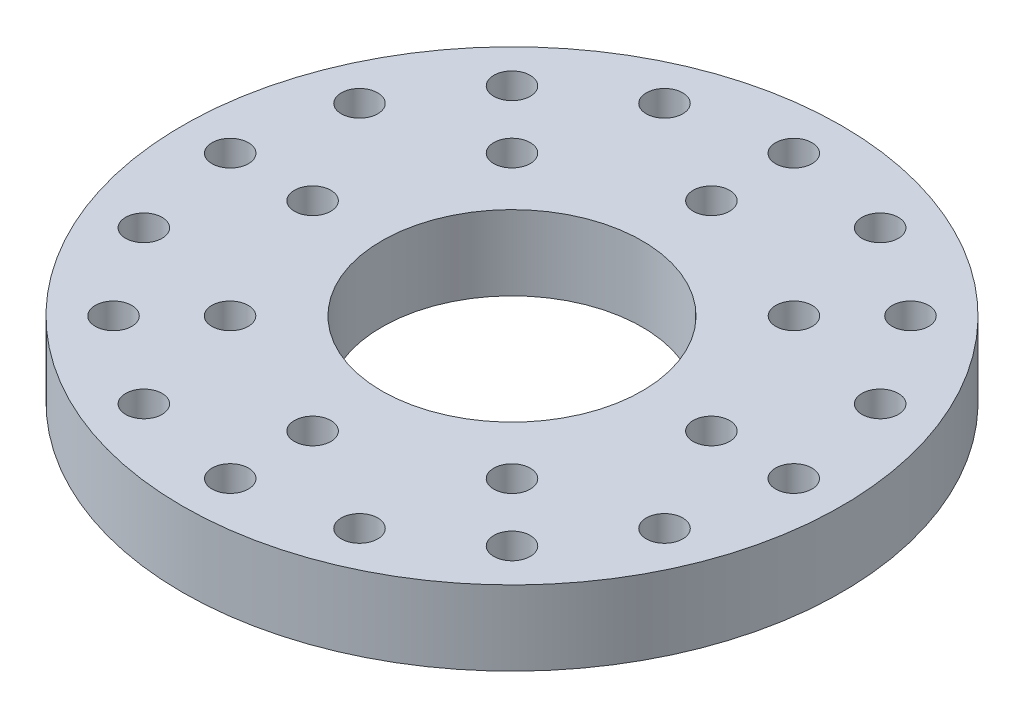
ISO-10303-21;
HEADER;
FILE_DESCRIPTION(('STEP AP214'),'2;1');
FILE_NAME('part.step','',(''),(''),'','','');
FILE_SCHEMA(('AUTOMOTIVE_DESIGN { 1 0 10303 214 1 1 1 1 }'));
ENDSEC;
DATA;
#1=APPLICATION_CONTEXT('core data for automotive mechanical design processes');
#2=APPLICATION_PROTOCOL_DEFINITION('international standard','automotive_design',2000,#1);
#3=PRODUCT_CONTEXT('',#1,'mechanical');
#4=PRODUCT('Part','Part','',(#3));
#5=PRODUCT_RELATED_PRODUCT_CATEGORY('part','',(#4));
#6=PRODUCT_DEFINITION_FORMATION('','',#4);
#7=PRODUCT_DEFINITION_CONTEXT('part definition',#1,'design');
#8=PRODUCT_DEFINITION('design','',#6,#7);
#9=PRODUCT_DEFINITION_SHAPE('','',#8);
#10=(LENGTH_UNIT() NAMED_UNIT(*) SI_UNIT(.MILLI.,.METRE.));
#11=(NAMED_UNIT(*) PLANE_ANGLE_UNIT() SI_UNIT($,.RADIAN.));
#12=(NAMED_UNIT(*) SI_UNIT($,.STERADIAN.) SOLID_ANGLE_UNIT());
#13=UNCERTAINTY_MEASURE_WITH_UNIT(LENGTH_MEASURE(1.E-05),#10,'distance_accuracy_value','');
#14=(GEOMETRIC_REPRESENTATION_CONTEXT(3) GLOBAL_UNCERTAINTY_ASSIGNED_CONTEXT((#13)) GLOBAL_UNIT_ASSIGNED_CONTEXT((#10,
#11,#12)) REPRESENTATION_CONTEXT('',''));
#15=CARTESIAN_POINT('',(0.,0.,0.));
#16=DIRECTION('',(0.,0.,1.));
#17=DIRECTION('',(1.,0.,0.));
#18=AXIS2_PLACEMENT_3D('',#15,#16,#17);
#19=CARTESIAN_POINT('',(0.,17.272,0.));
#20=DIRECTION('',(0.,1.,0.));
#21=DIRECTION('',(0.,0.,1.));
#22=AXIS2_PLACEMENT_3D('',#19,#20,#21);
#23=PLANE('',#22);
#24=CARTESIAN_POINT('',(46.0687139010842,17.272,-46.0687139010853));
#25=DIRECTION('',(0.,1.,0.));
#26=DIRECTION('',(0.,0.,1.));
#27=AXIS2_PLACEMENT_3D('',#24,#25,#26);
#28=CIRCLE('',#27,4.2164);
#29=CARTESIAN_POINT('',(46.0687139010842,17.272,-41.8523139010853));
#30=VERTEX_POINT('',#29);
#31=EDGE_CURVE('E178',#30,#30,#28,.F.);
#32=ORIENTED_EDGE('',*,*,#31,.T.);
#33=EDGE_LOOP('',(#32));
#34=FACE_BOUND('',#33,.T.);
#35=CARTESIAN_POINT('',(65.151,17.272,-6.82420502120907E-13));
#36=DIRECTION('',(0.,1.,0.));
#37=DIRECTION('',(0.,0.,1.));
#38=AXIS2_PLACEMENT_3D('',#35,#36,#37);
#39=CIRCLE('',#38,4.2164);
#40=CARTESIAN_POINT('',(65.151,17.272,4.21639999999932));
#41=VERTEX_POINT('',#40);
#42=EDGE_CURVE('E166',#41,#41,#39,.F.);
#43=ORIENTED_EDGE('',*,*,#42,.T.);
#44=EDGE_LOOP('',(#43));
#45=FACE_BOUND('',#44,.T.);
#46=CARTESIAN_POINT('',(46.0687139010852,17.272,46.0687139010844));
#47=DIRECTION('',(0.,1.,0.));
#48=DIRECTION('',(0.,0.,1.));
#49=AXIS2_PLACEMENT_3D('',#46,#47,#48);
#50=CIRCLE('',#49,4.2164);
#51=CARTESIAN_POINT('',(46.0687139010852,17.272,50.2851139010844));
#52=VERTEX_POINT('',#51);
#53=EDGE_CURVE('E154',#52,#52,#50,.F.);
#54=ORIENTED_EDGE('',*,*,#53,.T.);
#55=EDGE_LOOP('',(#54));
#56=FACE_BOUND('',#55,.T.);
#57=CARTESIAN_POINT('',(4.54947001413938E-13,17.272,65.151));
#58=DIRECTION('',(0.,1.,0.));
#59=DIRECTION('',(0.,0.,1.));
#60=AXIS2_PLACEMENT_3D('',#57,#58,#59);
#61=CIRCLE('',#60,4.2164);
#62=CARTESIAN_POINT('',(4.54947001413938E-13,17.272,69.3674));
#63=VERTEX_POINT('',#62);
#64=EDGE_CURVE('E142',#63,#63,#61,.F.);
#65=ORIENTED_EDGE('',*,*,#64,.T.);
#66=EDGE_LOOP('',(#65));
#67=FACE_BOUND('',#66,.T.);
#68=CARTESIAN_POINT('',(-46.0687139010845,17.272,46.068713901085));
#69=DIRECTION('',(0.,1.,0.));
#70=DIRECTION('',(0.,0.,1.));
#71=AXIS2_PLACEMENT_3D('',#68,#69,#70);
#72=CIRCLE('',#71,4.2164);
#73=CARTESIAN_POINT('',(-46.0687139010845,17.272,50.285113901085));
#74=VERTEX_POINT('',#73);
#75=EDGE_CURVE('E130',#74,#74,#72,.F.);
#76=ORIENTED_EDGE('',*,*,#75,.T.);
#77=EDGE_LOOP('',(#76));
#78=FACE_BOUND('',#77,.T.);
#79=CARTESIAN_POINT('',(-65.151,17.272,2.27473500706969E-13));
#80=DIRECTION('',(0.,1.,0.));
#81=DIRECTION('',(0.,0.,1.));
#82=AXIS2_PLACEMENT_3D('',#79,#80,#81);
#83=CIRCLE('',#82,4.2164);
#84=CARTESIAN_POINT('',(-65.151,17.272,4.21640000000023));
#85=VERTEX_POINT('',#84);
#86=EDGE_CURVE('E118',#85,#85,#83,.F.);
#87=ORIENTED_EDGE('',*,*,#86,.T.);
#88=EDGE_LOOP('',(#87));
#89=FACE_BOUND('',#88,.T.);
#90=CARTESIAN_POINT('',(-46.0687139010848,17.272,-46.0687139010847));
#91=DIRECTION('',(0.,1.,0.));
#92=DIRECTION('',(0.,0.,1.));
#93=AXIS2_PLACEMENT_3D('',#90,#91,#92);
#94=CIRCLE('',#93,4.2164);
#95=CARTESIAN_POINT('',(-46.0687139010848,17.272,-41.8523139010847));
#96=VERTEX_POINT('',#95);
#97=EDGE_CURVE('E106',#96,#96,#94,.F.);
#98=ORIENTED_EDGE('',*,*,#97,.T.);
#99=EDGE_LOOP('',(#98));
#100=FACE_BOUND('',#99,.T.);
#101=CARTESIAN_POINT('',(0.,17.272,-65.151));
#102=DIRECTION('',(0.,1.,0.));
#103=DIRECTION('',(0.,0.,1.));
#104=AXIS2_PLACEMENT_3D('',#101,#102,#103);
#105=CIRCLE('',#104,4.2164);
#106=CARTESIAN_POINT('',(0.,17.272,-60.9346));
#107=VERTEX_POINT('',#106);
#108=EDGE_CURVE('E94',#107,#107,#105,.F.);
#109=ORIENTED_EDGE('',*,*,#108,.T.);
#110=EDGE_LOOP('',(#109));
#111=FACE_BOUND('',#110,.T.);
#112=CARTESIAN_POINT('',(46.101,17.272,-4.82882343606022E-13));
#113=DIRECTION('',(0.,1.,0.));
#114=DIRECTION('',(0.,0.,1.));
#115=AXIS2_PLACEMENT_3D('',#112,#113,#114);
#116=CIRCLE('',#115,4.2164);
#117=CARTESIAN_POINT('',(46.101,17.272,4.21639999999952));
#118=VERTEX_POINT('',#117);
#119=EDGE_CURVE('E82',#118,#118,#116,.F.);
#120=ORIENTED_EDGE('',*,*,#119,.T.);
#121=EDGE_LOOP('',(#120));
#122=FACE_BOUND('',#121,.T.);
#123=CARTESIAN_POINT('',(3.21921562404015E-13,17.272,46.101));
#124=DIRECTION('',(0.,1.,0.));
#125=DIRECTION('',(0.,0.,1.));
#126=AXIS2_PLACEMENT_3D('',#123,#124,#125);
#127=CIRCLE('',#126,4.2164);
#128=CARTESIAN_POINT('',(3.21921562404015E-13,17.272,50.3174));
#129=VERTEX_POINT('',#128);
#130=EDGE_CURVE('E70',#129,#129,#127,.F.);
#131=ORIENTED_EDGE('',*,*,#130,.T.);
#132=EDGE_LOOP('',(#131));
#133=FACE_BOUND('',#132,.T.);
#134=CARTESIAN_POINT('',(-46.101,17.272,1.60960781202007E-13));
#135=DIRECTION('',(0.,1.,0.));
#136=DIRECTION('',(0.,0.,1.));
#137=AXIS2_PLACEMENT_3D('',#134,#135,#136);
#138=CIRCLE('',#137,4.2164);
#139=CARTESIAN_POINT('',(-46.101,17.272,4.21640000000016));
#140=VERTEX_POINT('',#139);
#141=EDGE_CURVE('E58',#140,#140,#138,.F.);
#142=ORIENTED_EDGE('',*,*,#141,.T.);
#143=EDGE_LOOP('',(#142));
#144=FACE_BOUND('',#143,.T.);
#145=CARTESIAN_POINT('',(0.,17.272,-46.101));
#146=DIRECTION('',(0.,1.,0.));
#147=DIRECTION('',(0.,0.,1.));
#148=AXIS2_PLACEMENT_3D('',#145,#146,#147);
#149=CIRCLE('',#148,4.2164);
#150=CARTESIAN_POINT('',(0.,17.272,-41.8846));
#151=VERTEX_POINT('',#150);
#152=EDGE_CURVE('E46',#151,#151,#149,.F.);
#153=ORIENTED_EDGE('',*,*,#152,.T.);
#154=EDGE_LOOP('',(#153));
#155=FACE_BOUND('',#154,.T.);
#156=CARTESIAN_POINT('',(0.,17.272,0.));
#157=DIRECTION('',(0.,1.,0.));
#158=DIRECTION('',(0.,0.,1.));
#159=AXIS2_PLACEMENT_3D('',#156,#157,#158);
#160=CIRCLE('',#159,76.2);
#161=CARTESIAN_POINT('',(0.,17.272,76.2));
#162=VERTEX_POINT('',#161);
#163=EDGE_CURVE('E10',#162,#162,#160,.T.);
#164=ORIENTED_EDGE('',*,*,#163,.T.);
#165=EDGE_LOOP('',(#164));
#166=FACE_BOUND('',#165,.T.);
#167=CARTESIAN_POINT('',(0.,17.272,0.));
#168=DIRECTION('',(0.,1.,0.));
#169=DIRECTION('',(0.,0.,1.));
#170=AXIS2_PLACEMENT_3D('',#167,#168,#169);
#171=CIRCLE('',#170,30.099);
#172=CARTESIAN_POINT('',(0.,17.272,30.099));
#173=VERTEX_POINT('',#172);
#174=EDGE_CURVE('E39',#173,#173,#171,.F.);
#175=ORIENTED_EDGE('',*,*,#174,.T.);
#176=EDGE_LOOP('',(#175));
#177=FACE_BOUND('',#176,.T.);
#178=CARTESIAN_POINT('',(-32.5983297194811,17.272,-32.598329719481));
#179=DIRECTION('',(0.,1.,0.));
#180=DIRECTION('',(0.,0.,1.));
#181=AXIS2_PLACEMENT_3D('',#178,#179,#180);
#182=CIRCLE('',#181,4.2164);
#183=CARTESIAN_POINT('',(-32.5983297194811,17.272,-28.381929719481));
#184=VERTEX_POINT('',#183);
#185=EDGE_CURVE('E52',#184,#184,#182,.F.);
#186=ORIENTED_EDGE('',*,*,#185,.T.);
#187=EDGE_LOOP('',(#186));
#188=FACE_BOUND('',#187,.T.);
#189=CARTESIAN_POINT('',(-32.5983297194809,17.272,32.5983297194812));
#190=DIRECTION('',(0.,1.,0.));
#191=DIRECTION('',(0.,0.,1.));
#192=AXIS2_PLACEMENT_3D('',#189,#190,#191);
#193=CIRCLE('',#192,4.2164);
#194=CARTESIAN_POINT('',(-32.5983297194809,17.272,36.8147297194812));
#195=VERTEX_POINT('',#194);
#196=EDGE_CURVE('E64',#195,#195,#193,.F.);
#197=ORIENTED_EDGE('',*,*,#196,.T.);
#198=EDGE_LOOP('',(#197));
#199=FACE_BOUND('',#198,.T.);
#200=CARTESIAN_POINT('',(32.5983297194813,17.272,32.5983297194807));
#201=DIRECTION('',(0.,1.,0.));
#202=DIRECTION('',(0.,0.,1.));
#203=AXIS2_PLACEMENT_3D('',#200,#201,#202);
#204=CIRCLE('',#203,4.2164);
#205=CARTESIAN_POINT('',(32.5983297194813,17.272,36.8147297194807));
#206=VERTEX_POINT('',#205);
#207=EDGE_CURVE('E76',#206,#206,#204,.F.);
#208=ORIENTED_EDGE('',*,*,#207,.T.);
#209=EDGE_LOOP('',(#208));
#210=FACE_BOUND('',#209,.T.);
#211=CARTESIAN_POINT('',(32.5983297194806,17.272,-32.5983297194814));
#212=DIRECTION('',(0.,1.,0.));
#213=DIRECTION('',(0.,0.,1.));
#214=AXIS2_PLACEMENT_3D('',#211,#212,#213);
#215=CIRCLE('',#214,4.2164);
#216=CARTESIAN_POINT('',(32.5983297194806,17.272,-28.3819297194814));
#217=VERTEX_POINT('',#216);
#218=EDGE_CURVE('E88',#217,#217,#215,.F.);
#219=ORIENTED_EDGE('',*,*,#218,.T.);
#220=EDGE_LOOP('',(#219));
#221=FACE_BOUND('',#220,.T.);
#222=CARTESIAN_POINT('',(-24.932208302018,17.272,-60.1916754226428));
#223=DIRECTION('',(0.,1.,0.));
#224=DIRECTION('',(0.,0.,1.));
#225=AXIS2_PLACEMENT_3D('',#222,#223,#224);
#226=CIRCLE('',#225,4.2164);
#227=CARTESIAN_POINT('',(-24.932208302018,17.272,-55.9752754226428));
#228=VERTEX_POINT('',#227);
#229=EDGE_CURVE('E100',#228,#228,#226,.F.);
#230=ORIENTED_EDGE('',*,*,#229,.T.);
#231=EDGE_LOOP('',(#230));
#232=FACE_BOUND('',#231,.T.);
#233=CARTESIAN_POINT('',(-60.1916754226429,17.272,-24.9322083020178));
#234=DIRECTION('',(0.,1.,0.));
#235=DIRECTION('',(0.,0.,1.));
#236=AXIS2_PLACEMENT_3D('',#233,#234,#235);
#237=CIRCLE('',#236,4.2164);
#238=CARTESIAN_POINT('',(-60.1916754226429,17.272,-20.7158083020178));
#239=VERTEX_POINT('',#238);
#240=EDGE_CURVE('E112',#239,#239,#237,.F.);
#241=ORIENTED_EDGE('',*,*,#240,.T.);
#242=EDGE_LOOP('',(#241));
#243=FACE_BOUND('',#242,.T.);
#244=CARTESIAN_POINT('',(-60.1916754226427,17.272,24.9322083020182));
#245=DIRECTION('',(0.,1.,0.));
#246=DIRECTION('',(0.,0.,1.));
#247=AXIS2_PLACEMENT_3D('',#244,#245,#246);
#248=CIRCLE('',#247,4.2164);
#249=CARTESIAN_POINT('',(-60.1916754226427,17.272,29.1486083020182));
#250=VERTEX_POINT('',#249);
#251=EDGE_CURVE('E124',#250,#250,#248,.F.);
#252=ORIENTED_EDGE('',*,*,#251,.T.);
#253=EDGE_LOOP('',(#252));
#254=FACE_BOUND('',#253,.T.);
#255=CARTESIAN_POINT('',(-24.9322083020176,17.272,60.191675422643));
#256=DIRECTION('',(0.,1.,0.));
#257=DIRECTION('',(0.,0.,1.));
#258=AXIS2_PLACEMENT_3D('',#255,#256,#257);
#259=CIRCLE('',#258,4.2164);
#260=CARTESIAN_POINT('',(-24.9322083020176,17.272,64.408075422643));
#261=VERTEX_POINT('',#260);
#262=EDGE_CURVE('E136',#261,#261,#259,.F.);
#263=ORIENTED_EDGE('',*,*,#262,.T.);
#264=EDGE_LOOP('',(#263));
#265=FACE_BOUND('',#264,.T.);
#266=CARTESIAN_POINT('',(24.9322083020184,17.272,60.1916754226427));
#267=DIRECTION('',(0.,1.,0.));
#268=DIRECTION('',(0.,0.,1.));
#269=AXIS2_PLACEMENT_3D('',#266,#267,#268);
#270=CIRCLE('',#269,4.2164);
#271=CARTESIAN_POINT('',(24.9322083020184,17.272,64.4080754226427));
#272=VERTEX_POINT('',#271);
#273=EDGE_CURVE('E148',#272,#272,#270,.F.);
#274=ORIENTED_EDGE('',*,*,#273,.T.);
#275=EDGE_LOOP('',(#274));
#276=FACE_BOUND('',#275,.T.);
#277=CARTESIAN_POINT('',(60.1916754226431,17.272,24.9322083020174));
#278=DIRECTION('',(0.,1.,0.));
#279=DIRECTION('',(0.,0.,1.));
#280=AXIS2_PLACEMENT_3D('',#277,#278,#279);
#281=CIRCLE('',#280,4.2164);
#282=CARTESIAN_POINT('',(60.1916754226431,17.272,29.1486083020174));
#283=VERTEX_POINT('',#282);
#284=EDGE_CURVE('E160',#283,#283,#281,.F.);
#285=ORIENTED_EDGE('',*,*,#284,.T.);
#286=EDGE_LOOP('',(#285));
#287=FACE_BOUND('',#286,.T.);
#288=CARTESIAN_POINT('',(60.1916754226426,17.272,-24.9322083020186));
#289=DIRECTION('',(0.,1.,0.));
#290=DIRECTION('',(0.,0.,1.));
#291=AXIS2_PLACEMENT_3D('',#288,#289,#290);
#292=CIRCLE('',#291,4.2164);
#293=CARTESIAN_POINT('',(60.1916754226426,17.272,-20.7158083020186));
#294=VERTEX_POINT('',#293);
#295=EDGE_CURVE('E172',#294,#294,#292,.F.);
#296=ORIENTED_EDGE('',*,*,#295,.T.);
#297=EDGE_LOOP('',(#296));
#298=FACE_BOUND('',#297,.T.);
#299=CARTESIAN_POINT('',(24.9322083020172,17.272,-60.1916754226432));
#300=DIRECTION('',(0.,1.,0.));
#301=DIRECTION('',(0.,0.,1.));
#302=AXIS2_PLACEMENT_3D('',#299,#300,#301);
#303=CIRCLE('',#302,4.2164);
#304=CARTESIAN_POINT('',(24.9322083020172,17.272,-55.9752754226432));
#305=VERTEX_POINT('',#304);
#306=EDGE_CURVE('E184',#305,#305,#303,.F.);
#307=ORIENTED_EDGE('',*,*,#306,.T.);
#308=EDGE_LOOP('',(#307));
#309=FACE_BOUND('',#308,.T.);
#310=ADVANCED_FACE('F28',(#34,#45,#56,#67,#78,#89,#100,#111,#122,#133,#144,#155,#166,#177,#188,
#199,#210,#221,#232,#243,#254,#265,#276,#287,#298,#309),#23,.T.);
#311=CARTESIAN_POINT('',(0.,0.,0.));
#312=DIRECTION('',(0.,1.,0.));
#313=DIRECTION('',(0.,0.,1.));
#314=AXIS2_PLACEMENT_3D('',#311,#312,#313);
#315=PLANE('',#314);
#316=CARTESIAN_POINT('',(46.0687139010842,0.,-46.0687139010853));
#317=DIRECTION('',(0.,1.,0.));
#318=DIRECTION('',(-0.707106781186539,0.,0.707106781186556));
#319=AXIS2_PLACEMENT_3D('',#316,#317,#318);
#320=CIRCLE('',#319,4.2164);
#321=CARTESIAN_POINT('',(43.0872688688893,0.,-43.0872688688903));
#322=VERTEX_POINT('',#321);
#323=EDGE_CURVE('E181',#322,#322,#320,.T.);
#324=ORIENTED_EDGE('',*,*,#323,.T.);
#325=EDGE_LOOP('',(#324));
#326=FACE_BOUND('',#325,.T.);
#327=CARTESIAN_POINT('',(65.151,0.,-6.82420502120907E-13));
#328=DIRECTION('',(0.,1.,0.));
#329=DIRECTION('',(-1.,0.,0.));
#330=AXIS2_PLACEMENT_3D('',#327,#328,#329);
#331=CIRCLE('',#330,4.2164);
#332=CARTESIAN_POINT('',(60.9346,0.,-6.38256056369612E-13));
#333=VERTEX_POINT('',#332);
#334=EDGE_CURVE('E169',#333,#333,#331,.T.);
#335=ORIENTED_EDGE('',*,*,#334,.T.);
#336=EDGE_LOOP('',(#335));
#337=FACE_BOUND('',#336,.T.);
#338=CARTESIAN_POINT('',(46.0687139010852,0.,46.0687139010844));
#339=DIRECTION('',(0.,1.,0.));
#340=DIRECTION('',(-0.707106781186554,0.,-0.707106781186541));
#341=AXIS2_PLACEMENT_3D('',#338,#339,#340);
#342=CIRCLE('',#341,4.2164);
#343=CARTESIAN_POINT('',(43.0872688688902,0.,43.0872688688894));
#344=VERTEX_POINT('',#343);
#345=EDGE_CURVE('E157',#344,#344,#342,.T.);
#346=ORIENTED_EDGE('',*,*,#345,.T.);
#347=EDGE_LOOP('',(#346));
#348=FACE_BOUND('',#347,.T.);
#349=CARTESIAN_POINT('',(4.54947001413938E-13,0.,65.151));
#350=DIRECTION('',(0.,1.,0.));
#351=DIRECTION('',(0.,0.,-1.));
#352=AXIS2_PLACEMENT_3D('',#349,#350,#351);
#353=CIRCLE('',#352,4.2164);
#354=CARTESIAN_POINT('',(4.25504037579742E-13,0.,60.9346));
#355=VERTEX_POINT('',#354);
#356=EDGE_CURVE('E145',#355,#355,#353,.T.);
#357=ORIENTED_EDGE('',*,*,#356,.T.);
#358=EDGE_LOOP('',(#357));
#359=FACE_BOUND('',#358,.T.);
#360=CARTESIAN_POINT('',(-46.0687139010845,0.,46.068713901085));
#361=DIRECTION('',(0.,1.,0.));
#362=DIRECTION('',(0.707106781186544,0.,-0.707106781186551));
#363=AXIS2_PLACEMENT_3D('',#360,#361,#362);
#364=CIRCLE('',#363,4.2164);
#365=CARTESIAN_POINT('',(-43.0872688688896,0.,43.08726886889));
#366=VERTEX_POINT('',#365);
#367=EDGE_CURVE('E133',#366,#366,#364,.T.);
#368=ORIENTED_EDGE('',*,*,#367,.T.);
#369=EDGE_LOOP('',(#368));
#370=FACE_BOUND('',#369,.T.);
#371=CARTESIAN_POINT('',(-65.151,0.,2.27473500706969E-13));
#372=DIRECTION('',(0.,1.,0.));
#373=DIRECTION('',(1.,0.,0.));
#374=AXIS2_PLACEMENT_3D('',#371,#372,#373);
#375=CIRCLE('',#374,4.2164);
#376=CARTESIAN_POINT('',(-60.9346,0.,2.12752018789871E-13));
#377=VERTEX_POINT('',#376);
#378=EDGE_CURVE('E121',#377,#377,#375,.T.);
#379=ORIENTED_EDGE('',*,*,#378,.T.);
#380=EDGE_LOOP('',(#379));
#381=FACE_BOUND('',#380,.T.);
#382=CARTESIAN_POINT('',(-46.0687139010848,0.,-46.0687139010847));
#383=DIRECTION('',(0.,1.,0.));
#384=DIRECTION('',(0.707106781186549,0.,0.707106781186546));
#385=AXIS2_PLACEMENT_3D('',#382,#383,#384);
#386=CIRCLE('',#385,4.2164);
#387=CARTESIAN_POINT('',(-43.0872688688899,0.,-43.0872688688897));
#388=VERTEX_POINT('',#387);
#389=EDGE_CURVE('E109',#388,#388,#386,.T.);
#390=ORIENTED_EDGE('',*,*,#389,.T.);
#391=EDGE_LOOP('',(#390));
#392=FACE_BOUND('',#391,.T.);
#393=CARTESIAN_POINT('',(0.,0.,-65.151));
#394=DIRECTION('',(0.,1.,0.));
#395=DIRECTION('',(0.,0.,1.));
#396=AXIS2_PLACEMENT_3D('',#393,#394,#395);
#397=CIRCLE('',#396,4.2164);
#398=CARTESIAN_POINT('',(0.,0.,-60.9346));
#399=VERTEX_POINT('',#398);
#400=EDGE_CURVE('E97',#399,#399,#397,.T.);
#401=ORIENTED_EDGE('',*,*,#400,.T.);
#402=EDGE_LOOP('',(#401));
#403=FACE_BOUND('',#402,.T.);
#404=CARTESIAN_POINT('',(46.101,0.,-4.82882343606022E-13));
#405=DIRECTION('',(0.,1.,0.));
#406=DIRECTION('',(-1.,0.,0.));
#407=AXIS2_PLACEMENT_3D('',#404,#405,#406);
#408=CIRCLE('',#407,4.2164);
#409=CARTESIAN_POINT('',(41.8846,0.,-4.38717897854727E-13));
#410=VERTEX_POINT('',#409);
#411=EDGE_CURVE('E85',#410,#410,#408,.T.);
#412=ORIENTED_EDGE('',*,*,#411,.T.);
#413=EDGE_LOOP('',(#412));
#414=FACE_BOUND('',#413,.T.);
#415=CARTESIAN_POINT('',(3.21921562404015E-13,0.,46.101));
#416=DIRECTION('',(0.,1.,0.));
#417=DIRECTION('',(0.,0.,-1.));
#418=AXIS2_PLACEMENT_3D('',#415,#416,#417);
#419=CIRCLE('',#418,4.2164);
#420=CARTESIAN_POINT('',(2.92478598569818E-13,0.,41.8846));
#421=VERTEX_POINT('',#420);
#422=EDGE_CURVE('E73',#421,#421,#419,.T.);
#423=ORIENTED_EDGE('',*,*,#422,.T.);
#424=EDGE_LOOP('',(#423));
#425=FACE_BOUND('',#424,.T.);
#426=CARTESIAN_POINT('',(-46.101,0.,1.60960781202007E-13));
#427=DIRECTION('',(0.,1.,0.));
#428=DIRECTION('',(1.,0.,0.));
#429=AXIS2_PLACEMENT_3D('',#426,#427,#428);
#430=CIRCLE('',#429,4.2164);
#431=CARTESIAN_POINT('',(-41.8846,0.,1.46239299284909E-13));
#432=VERTEX_POINT('',#431);
#433=EDGE_CURVE('E61',#432,#432,#430,.T.);
#434=ORIENTED_EDGE('',*,*,#433,.T.);
#435=EDGE_LOOP('',(#434));
#436=FACE_BOUND('',#435,.T.);
#437=CARTESIAN_POINT('',(0.,0.,-46.101));
#438=DIRECTION('',(0.,1.,0.));
#439=DIRECTION('',(0.,0.,1.));
#440=AXIS2_PLACEMENT_3D('',#437,#438,#439);
#441=CIRCLE('',#440,4.2164);
#442=CARTESIAN_POINT('',(0.,0.,-41.8846));
#443=VERTEX_POINT('',#442);
#444=EDGE_CURVE('E49',#443,#443,#441,.T.);
#445=ORIENTED_EDGE('',*,*,#444,.T.);
#446=EDGE_LOOP('',(#445));
#447=FACE_BOUND('',#446,.T.);
#448=CARTESIAN_POINT('',(0.,0.,0.));
#449=DIRECTION('',(0.,1.,0.));
#450=DIRECTION('',(0.,0.,1.));
#451=AXIS2_PLACEMENT_3D('',#448,#449,#450);
#452=CIRCLE('',#451,76.2);
#453=CARTESIAN_POINT('',(0.,0.,76.2));
#454=VERTEX_POINT('',#453);
#455=EDGE_CURVE('E32',#454,#454,#452,.T.);
#456=ORIENTED_EDGE('',*,*,#455,.F.);
#457=EDGE_LOOP('',(#456));
#458=FACE_BOUND('',#457,.T.);
#459=CARTESIAN_POINT('',(0.,0.,0.));
#460=DIRECTION('',(0.,1.,0.));
#461=DIRECTION('',(0.,0.,1.));
#462=AXIS2_PLACEMENT_3D('',#459,#460,#461);
#463=CIRCLE('',#462,30.099);
#464=CARTESIAN_POINT('',(0.,0.,30.099));
#465=VERTEX_POINT('',#464);
#466=EDGE_CURVE('E43',#465,#465,#463,.T.);
#467=ORIENTED_EDGE('',*,*,#466,.T.);
#468=EDGE_LOOP('',(#467));
#469=FACE_BOUND('',#468,.T.);
#470=CARTESIAN_POINT('',(-32.5983297194811,0.,-32.598329719481));
#471=DIRECTION('',(0.,1.,0.));
#472=DIRECTION('',(0.707106781186549,0.,0.707106781186546));
#473=AXIS2_PLACEMENT_3D('',#470,#471,#472);
#474=CIRCLE('',#473,4.2164);
#475=CARTESIAN_POINT('',(-29.6168846872861,0.,-29.616884687286));
#476=VERTEX_POINT('',#475);
#477=EDGE_CURVE('E55',#476,#476,#474,.T.);
#478=ORIENTED_EDGE('',*,*,#477,.T.);
#479=EDGE_LOOP('',(#478));
#480=FACE_BOUND('',#479,.T.);
#481=CARTESIAN_POINT('',(-32.5983297194809,0.,32.5983297194812));
#482=DIRECTION('',(0.,1.,0.));
#483=DIRECTION('',(0.707106781186544,0.,-0.707106781186551));
#484=AXIS2_PLACEMENT_3D('',#481,#482,#483);
#485=CIRCLE('',#484,4.2164);
#486=CARTESIAN_POINT('',(-29.6168846872859,0.,29.6168846872862));
#487=VERTEX_POINT('',#486);
#488=EDGE_CURVE('E67',#487,#487,#485,.T.);
#489=ORIENTED_EDGE('',*,*,#488,.T.);
#490=EDGE_LOOP('',(#489));
#491=FACE_BOUND('',#490,.T.);
#492=CARTESIAN_POINT('',(32.5983297194813,0.,32.5983297194807));
#493=DIRECTION('',(0.,1.,0.));
#494=DIRECTION('',(-0.707106781186554,0.,-0.707106781186541));
#495=AXIS2_PLACEMENT_3D('',#492,#493,#494);
#496=CIRCLE('',#495,4.2164);
#497=CARTESIAN_POINT('',(29.6168846872863,0.,29.6168846872858));
#498=VERTEX_POINT('',#497);
#499=EDGE_CURVE('E79',#498,#498,#496,.T.);
#500=ORIENTED_EDGE('',*,*,#499,.T.);
#501=EDGE_LOOP('',(#500));
#502=FACE_BOUND('',#501,.T.);
#503=CARTESIAN_POINT('',(32.5983297194806,0.,-32.5983297194814));
#504=DIRECTION('',(0.,1.,0.));
#505=DIRECTION('',(-0.707106781186539,0.,0.707106781186556));
#506=AXIS2_PLACEMENT_3D('',#503,#504,#505);
#507=CIRCLE('',#506,4.2164);
#508=CARTESIAN_POINT('',(29.6168846872857,0.,-29.6168846872864));
#509=VERTEX_POINT('',#508);
#510=EDGE_CURVE('E91',#509,#509,#507,.T.);
#511=ORIENTED_EDGE('',*,*,#510,.T.);
#512=EDGE_LOOP('',(#511));
#513=FACE_BOUND('',#512,.T.);
#514=CARTESIAN_POINT('',(-24.932208302018,0.,-60.1916754226428));
#515=DIRECTION('',(0.,1.,0.));
#516=DIRECTION('',(0.382683432365091,0.,0.923879532511287));
#517=AXIS2_PLACEMENT_3D('',#514,#515,#516);
#518=CIRCLE('',#517,4.2164);
#519=CARTESIAN_POINT('',(-23.3186618777939,0.,-56.2962297617622));
#520=VERTEX_POINT('',#519);
#521=EDGE_CURVE('E103',#520,#520,#518,.T.);
#522=ORIENTED_EDGE('',*,*,#521,.T.);
#523=EDGE_LOOP('',(#522));
#524=FACE_BOUND('',#523,.T.);
#525=CARTESIAN_POINT('',(-60.1916754226429,0.,-24.9322083020178));
#526=DIRECTION('',(0.,1.,0.));
#527=DIRECTION('',(0.923879532511288,0.,0.382683432365087));
#528=AXIS2_PLACEMENT_3D('',#525,#526,#527);
#529=CIRCLE('',#528,4.2164);
#530=CARTESIAN_POINT('',(-56.2962297617623,0.,-23.3186618777936));
#531=VERTEX_POINT('',#530);
#532=EDGE_CURVE('E115',#531,#531,#529,.T.);
#533=ORIENTED_EDGE('',*,*,#532,.T.);
#534=EDGE_LOOP('',(#533));
#535=FACE_BOUND('',#534,.T.);
#536=CARTESIAN_POINT('',(-60.1916754226427,0.,24.9322083020182));
#537=DIRECTION('',(0.,1.,0.));
#538=DIRECTION('',(0.923879532511285,0.,-0.382683432365094));
#539=AXIS2_PLACEMENT_3D('',#536,#537,#538);
#540=CIRCLE('',#539,4.2164);
#541=CARTESIAN_POINT('',(-56.2962297617622,0.,23.318661877794));
#542=VERTEX_POINT('',#541);
#543=EDGE_CURVE('E127',#542,#542,#540,.T.);
#544=ORIENTED_EDGE('',*,*,#543,.T.);
#545=EDGE_LOOP('',(#544));
#546=FACE_BOUND('',#545,.T.);
#547=CARTESIAN_POINT('',(-24.9322083020176,0.,60.191675422643));
#548=DIRECTION('',(0.,1.,0.));
#549=DIRECTION('',(0.382683432365084,0.,-0.923879532511289));
#550=AXIS2_PLACEMENT_3D('',#547,#548,#549);
#551=CIRCLE('',#550,4.2164);
#552=CARTESIAN_POINT('',(-23.3186618777935,0.,56.2962297617624));
#553=VERTEX_POINT('',#552);
#554=EDGE_CURVE('E139',#553,#553,#551,.T.);
#555=ORIENTED_EDGE('',*,*,#554,.T.);
#556=EDGE_LOOP('',(#555));
#557=FACE_BOUND('',#556,.T.);
#558=CARTESIAN_POINT('',(24.9322083020184,0.,60.1916754226427));
#559=DIRECTION('',(0.,1.,0.));
#560=DIRECTION('',(-0.382683432365097,0.,-0.923879532511284));
#561=AXIS2_PLACEMENT_3D('',#558,#559,#560);
#562=CIRCLE('',#561,4.2164);
#563=CARTESIAN_POINT('',(23.3186618777942,0.,56.2962297617621));
#564=VERTEX_POINT('',#563);
#565=EDGE_CURVE('E151',#564,#564,#562,.T.);
#566=ORIENTED_EDGE('',*,*,#565,.T.);
#567=EDGE_LOOP('',(#566));
#568=FACE_BOUND('',#567,.T.);
#569=CARTESIAN_POINT('',(60.1916754226431,0.,24.9322083020174));
#570=DIRECTION('',(0.,1.,0.));
#571=DIRECTION('',(-0.923879532511291,0.,-0.382683432365081));
#572=AXIS2_PLACEMENT_3D('',#569,#570,#571);
#573=CIRCLE('',#572,4.2164);
#574=CARTESIAN_POINT('',(56.2962297617625,0.,23.3186618777932));
#575=VERTEX_POINT('',#574);
#576=EDGE_CURVE('E163',#575,#575,#573,.T.);
#577=ORIENTED_EDGE('',*,*,#576,.T.);
#578=EDGE_LOOP('',(#577));
#579=FACE_BOUND('',#578,.T.);
#580=CARTESIAN_POINT('',(60.1916754226426,0.,-24.9322083020186));
#581=DIRECTION('',(0.,1.,0.));
#582=DIRECTION('',(-0.923879532511283,0.,0.3826834323651));
#583=AXIS2_PLACEMENT_3D('',#580,#581,#582);
#584=CIRCLE('',#583,4.2164);
#585=CARTESIAN_POINT('',(56.296229761762,0.,-23.3186618777944));
#586=VERTEX_POINT('',#585);
#587=EDGE_CURVE('E175',#586,#586,#584,.T.);
#588=ORIENTED_EDGE('',*,*,#587,.T.);
#589=EDGE_LOOP('',(#588));
#590=FACE_BOUND('',#589,.T.);
#591=CARTESIAN_POINT('',(24.9322083020172,0.,-60.1916754226432));
#592=DIRECTION('',(0.,1.,0.));
#593=DIRECTION('',(-0.382683432365077,0.,0.923879532511292));
#594=AXIS2_PLACEMENT_3D('',#591,#592,#593);
#595=CIRCLE('',#594,4.2164);
#596=CARTESIAN_POINT('',(23.318661877793,0.,-56.2962297617626));
#597=VERTEX_POINT('',#596);
#598=EDGE_CURVE('E187',#597,#597,#595,.T.);
#599=ORIENTED_EDGE('',*,*,#598,.T.);
#600=EDGE_LOOP('',(#599));
#601=FACE_BOUND('',#600,.T.);
#602=ADVANCED_FACE('F191',(#326,#337,#348,#359,#370,#381,#392,#403,#414,#425,#436,#447,#458,
#469,#480,#491,#502,#513,#524,#535,#546,#557,#568,#579,#590,#601),#315,.F.);
#603=CARTESIAN_POINT('',(0.,17.272,0.));
#604=DIRECTION('',(0.,-1.,0.));
#605=DIRECTION('',(0.,0.,-1.));
#606=AXIS2_PLACEMENT_3D('',#603,#604,#605);
#607=CYLINDRICAL_SURFACE('',#606,76.2);
#608=ORIENTED_EDGE('',*,*,#163,.F.);
#609=EDGE_LOOP('',(#608));
#610=FACE_BOUND('',#609,.T.);
#611=ORIENTED_EDGE('',*,*,#455,.T.);
#612=EDGE_LOOP('',(#611));
#613=FACE_BOUND('',#612,.T.);
#614=ADVANCED_FACE('F30',(#610,#613),#607,.T.);
#615=CARTESIAN_POINT('',(0.,22.352,0.));
#616=DIRECTION('',(0.,-1.,0.));
#617=DIRECTION('',(0.,0.,-1.));
#618=AXIS2_PLACEMENT_3D('',#615,#616,#617);
#619=CYLINDRICAL_SURFACE('',#618,30.099);
#620=ORIENTED_EDGE('',*,*,#174,.F.);
#621=EDGE_LOOP('',(#620));
#622=FACE_BOUND('',#621,.T.);
#623=ORIENTED_EDGE('',*,*,#466,.F.);
#624=EDGE_LOOP('',(#623));
#625=FACE_BOUND('',#624,.T.);
#626=ADVANCED_FACE('F214',(#622,#625),#619,.F.);
#627=CARTESIAN_POINT('',(0.,22.352,-46.101));
#628=DIRECTION('',(0.,-1.,0.));
#629=DIRECTION('',(0.,0.,-1.));
#630=AXIS2_PLACEMENT_3D('',#627,#628,#629);
#631=CYLINDRICAL_SURFACE('',#630,4.2164);
#632=ORIENTED_EDGE('',*,*,#152,.F.);
#633=EDGE_LOOP('',(#632));
#634=FACE_BOUND('',#633,.T.);
#635=ORIENTED_EDGE('',*,*,#444,.F.);
#636=EDGE_LOOP('',(#635));
#637=FACE_BOUND('',#636,.T.);
#638=ADVANCED_FACE('F217',(#634,#637),#631,.F.);
#639=CARTESIAN_POINT('',(-32.5983297194811,22.352,-32.598329719481));
#640=DIRECTION('',(0.,-1.,0.));
#641=DIRECTION('',(0.,0.,-1.));
#642=AXIS2_PLACEMENT_3D('',#639,#640,#641);
#643=CYLINDRICAL_SURFACE('',#642,4.2164);
#644=ORIENTED_EDGE('',*,*,#185,.F.);
#645=EDGE_LOOP('',(#644));
#646=FACE_BOUND('',#645,.T.);
#647=ORIENTED_EDGE('',*,*,#477,.F.);
#648=EDGE_LOOP('',(#647));
#649=FACE_BOUND('',#648,.T.);
#650=ADVANCED_FACE('F221',(#646,#649),#643,.F.);
#651=CARTESIAN_POINT('',(-46.101,22.352,1.60960781202007E-13));
#652=DIRECTION('',(0.,-1.,0.));
#653=DIRECTION('',(0.,0.,-1.));
#654=AXIS2_PLACEMENT_3D('',#651,#652,#653);
#655=CYLINDRICAL_SURFACE('',#654,4.2164);
#656=ORIENTED_EDGE('',*,*,#141,.F.);
#657=EDGE_LOOP('',(#656));
#658=FACE_BOUND('',#657,.T.);
#659=ORIENTED_EDGE('',*,*,#433,.F.);
#660=EDGE_LOOP('',(#659));
#661=FACE_BOUND('',#660,.T.);
#662=ADVANCED_FACE('F225',(#658,#661),#655,.F.);
#663=CARTESIAN_POINT('',(-32.5983297194809,22.352,32.5983297194812));
#664=DIRECTION('',(0.,-1.,0.));
#665=DIRECTION('',(0.,0.,-1.));
#666=AXIS2_PLACEMENT_3D('',#663,#664,#665);
#667=CYLINDRICAL_SURFACE('',#666,4.2164);
#668=ORIENTED_EDGE('',*,*,#196,.F.);
#669=EDGE_LOOP('',(#668));
#670=FACE_BOUND('',#669,.T.);
#671=ORIENTED_EDGE('',*,*,#488,.F.);
#672=EDGE_LOOP('',(#671));
#673=FACE_BOUND('',#672,.T.);
#674=ADVANCED_FACE('F229',(#670,#673),#667,.F.);
#675=CARTESIAN_POINT('',(3.21921562404015E-13,22.352,46.101));
#676=DIRECTION('',(0.,-1.,0.));
#677=DIRECTION('',(0.,0.,-1.));
#678=AXIS2_PLACEMENT_3D('',#675,#676,#677);
#679=CYLINDRICAL_SURFACE('',#678,4.2164);
#680=ORIENTED_EDGE('',*,*,#130,.F.);
#681=EDGE_LOOP('',(#680));
#682=FACE_BOUND('',#681,.T.);
#683=ORIENTED_EDGE('',*,*,#422,.F.);
#684=EDGE_LOOP('',(#683));
#685=FACE_BOUND('',#684,.T.);
#686=ADVANCED_FACE('F233',(#682,#685),#679,.F.);
#687=CARTESIAN_POINT('',(32.5983297194813,22.352,32.5983297194807));
#688=DIRECTION('',(0.,-1.,0.));
#689=DIRECTION('',(0.,0.,-1.));
#690=AXIS2_PLACEMENT_3D('',#687,#688,#689);
#691=CYLINDRICAL_SURFACE('',#690,4.2164);
#692=ORIENTED_EDGE('',*,*,#207,.F.);
#693=EDGE_LOOP('',(#692));
#694=FACE_BOUND('',#693,.T.);
#695=ORIENTED_EDGE('',*,*,#499,.F.);
#696=EDGE_LOOP('',(#695));
#697=FACE_BOUND('',#696,.T.);
#698=ADVANCED_FACE('F237',(#694,#697),#691,.F.);
#699=CARTESIAN_POINT('',(46.101,22.352,-4.82882343606022E-13));
#700=DIRECTION('',(0.,-1.,0.));
#701=DIRECTION('',(0.,0.,-1.));
#702=AXIS2_PLACEMENT_3D('',#699,#700,#701);
#703=CYLINDRICAL_SURFACE('',#702,4.2164);
#704=ORIENTED_EDGE('',*,*,#119,.F.);
#705=EDGE_LOOP('',(#704));
#706=FACE_BOUND('',#705,.T.);
#707=ORIENTED_EDGE('',*,*,#411,.F.);
#708=EDGE_LOOP('',(#707));
#709=FACE_BOUND('',#708,.T.);
#710=ADVANCED_FACE('F241',(#706,#709),#703,.F.);
#711=CARTESIAN_POINT('',(32.5983297194806,22.352,-32.5983297194814));
#712=DIRECTION('',(0.,-1.,0.));
#713=DIRECTION('',(0.,0.,-1.));
#714=AXIS2_PLACEMENT_3D('',#711,#712,#713);
#715=CYLINDRICAL_SURFACE('',#714,4.2164);
#716=ORIENTED_EDGE('',*,*,#218,.F.);
#717=EDGE_LOOP('',(#716));
#718=FACE_BOUND('',#717,.T.);
#719=ORIENTED_EDGE('',*,*,#510,.F.);
#720=EDGE_LOOP('',(#719));
#721=FACE_BOUND('',#720,.T.);
#722=ADVANCED_FACE('F245',(#718,#721),#715,.F.);
#723=CARTESIAN_POINT('',(0.,22.352,-65.151));
#724=DIRECTION('',(0.,-1.,0.));
#725=DIRECTION('',(0.,0.,-1.));
#726=AXIS2_PLACEMENT_3D('',#723,#724,#725);
#727=CYLINDRICAL_SURFACE('',#726,4.2164);
#728=ORIENTED_EDGE('',*,*,#108,.F.);
#729=EDGE_LOOP('',(#728));
#730=FACE_BOUND('',#729,.T.);
#731=ORIENTED_EDGE('',*,*,#400,.F.);
#732=EDGE_LOOP('',(#731));
#733=FACE_BOUND('',#732,.T.);
#734=ADVANCED_FACE('F249',(#730,#733),#727,.F.);
#735=CARTESIAN_POINT('',(-24.932208302018,22.352,-60.1916754226428));
#736=DIRECTION('',(0.,-1.,0.));
#737=DIRECTION('',(0.,0.,-1.));
#738=AXIS2_PLACEMENT_3D('',#735,#736,#737);
#739=CYLINDRICAL_SURFACE('',#738,4.2164);
#740=ORIENTED_EDGE('',*,*,#229,.F.);
#741=EDGE_LOOP('',(#740));
#742=FACE_BOUND('',#741,.T.);
#743=ORIENTED_EDGE('',*,*,#521,.F.);
#744=EDGE_LOOP('',(#743));
#745=FACE_BOUND('',#744,.T.);
#746=ADVANCED_FACE('F253',(#742,#745),#739,.F.);
#747=CARTESIAN_POINT('',(-46.0687139010848,22.352,-46.0687139010847));
#748=DIRECTION('',(0.,-1.,0.));
#749=DIRECTION('',(0.,0.,-1.));
#750=AXIS2_PLACEMENT_3D('',#747,#748,#749);
#751=CYLINDRICAL_SURFACE('',#750,4.2164);
#752=ORIENTED_EDGE('',*,*,#97,.F.);
#753=EDGE_LOOP('',(#752));
#754=FACE_BOUND('',#753,.T.);
#755=ORIENTED_EDGE('',*,*,#389,.F.);
#756=EDGE_LOOP('',(#755));
#757=FACE_BOUND('',#756,.T.);
#758=ADVANCED_FACE('F257',(#754,#757),#751,.F.);
#759=CARTESIAN_POINT('',(-60.1916754226429,22.352,-24.9322083020178));
#760=DIRECTION('',(0.,-1.,0.));
#761=DIRECTION('',(0.,0.,-1.));
#762=AXIS2_PLACEMENT_3D('',#759,#760,#761);
#763=CYLINDRICAL_SURFACE('',#762,4.2164);
#764=ORIENTED_EDGE('',*,*,#240,.F.);
#765=EDGE_LOOP('',(#764));
#766=FACE_BOUND('',#765,.T.);
#767=ORIENTED_EDGE('',*,*,#532,.F.);
#768=EDGE_LOOP('',(#767));
#769=FACE_BOUND('',#768,.T.);
#770=ADVANCED_FACE('F261',(#766,#769),#763,.F.);
#771=CARTESIAN_POINT('',(-65.151,22.352,2.27473500706969E-13));
#772=DIRECTION('',(0.,-1.,0.));
#773=DIRECTION('',(0.,0.,-1.));
#774=AXIS2_PLACEMENT_3D('',#771,#772,#773);
#775=CYLINDRICAL_SURFACE('',#774,4.2164);
#776=ORIENTED_EDGE('',*,*,#86,.F.);
#777=EDGE_LOOP('',(#776));
#778=FACE_BOUND('',#777,.T.);
#779=ORIENTED_EDGE('',*,*,#378,.F.);
#780=EDGE_LOOP('',(#779));
#781=FACE_BOUND('',#780,.T.);
#782=ADVANCED_FACE('F265',(#778,#781),#775,.F.);
#783=CARTESIAN_POINT('',(-60.1916754226427,22.352,24.9322083020182));
#784=DIRECTION('',(0.,-1.,0.));
#785=DIRECTION('',(0.,0.,-1.));
#786=AXIS2_PLACEMENT_3D('',#783,#784,#785);
#787=CYLINDRICAL_SURFACE('',#786,4.2164);
#788=ORIENTED_EDGE('',*,*,#251,.F.);
#789=EDGE_LOOP('',(#788));
#790=FACE_BOUND('',#789,.T.);
#791=ORIENTED_EDGE('',*,*,#543,.F.);
#792=EDGE_LOOP('',(#791));
#793=FACE_BOUND('',#792,.T.);
#794=ADVANCED_FACE('F269',(#790,#793),#787,.F.);
#795=CARTESIAN_POINT('',(-46.0687139010845,22.352,46.068713901085));
#796=DIRECTION('',(0.,-1.,0.));
#797=DIRECTION('',(0.,0.,-1.));
#798=AXIS2_PLACEMENT_3D('',#795,#796,#797);
#799=CYLINDRICAL_SURFACE('',#798,4.2164);
#800=ORIENTED_EDGE('',*,*,#75,.F.);
#801=EDGE_LOOP('',(#800));
#802=FACE_BOUND('',#801,.T.);
#803=ORIENTED_EDGE('',*,*,#367,.F.);
#804=EDGE_LOOP('',(#803));
#805=FACE_BOUND('',#804,.T.);
#806=ADVANCED_FACE('F273',(#802,#805),#799,.F.);
#807=CARTESIAN_POINT('',(-24.9322083020176,22.352,60.191675422643));
#808=DIRECTION('',(0.,-1.,0.));
#809=DIRECTION('',(0.,0.,-1.));
#810=AXIS2_PLACEMENT_3D('',#807,#808,#809);
#811=CYLINDRICAL_SURFACE('',#810,4.2164);
#812=ORIENTED_EDGE('',*,*,#262,.F.);
#813=EDGE_LOOP('',(#812));
#814=FACE_BOUND('',#813,.T.);
#815=ORIENTED_EDGE('',*,*,#554,.F.);
#816=EDGE_LOOP('',(#815));
#817=FACE_BOUND('',#816,.T.);
#818=ADVANCED_FACE('F277',(#814,#817),#811,.F.);
#819=CARTESIAN_POINT('',(4.54947001413938E-13,22.352,65.151));
#820=DIRECTION('',(0.,-1.,0.));
#821=DIRECTION('',(0.,0.,-1.));
#822=AXIS2_PLACEMENT_3D('',#819,#820,#821);
#823=CYLINDRICAL_SURFACE('',#822,4.2164);
#824=ORIENTED_EDGE('',*,*,#64,.F.);
#825=EDGE_LOOP('',(#824));
#826=FACE_BOUND('',#825,.T.);
#827=ORIENTED_EDGE('',*,*,#356,.F.);
#828=EDGE_LOOP('',(#827));
#829=FACE_BOUND('',#828,.T.);
#830=ADVANCED_FACE('F281',(#826,#829),#823,.F.);
#831=CARTESIAN_POINT('',(24.9322083020184,22.352,60.1916754226427));
#832=DIRECTION('',(0.,-1.,0.));
#833=DIRECTION('',(0.,0.,-1.));
#834=AXIS2_PLACEMENT_3D('',#831,#832,#833);
#835=CYLINDRICAL_SURFACE('',#834,4.2164);
#836=ORIENTED_EDGE('',*,*,#273,.F.);
#837=EDGE_LOOP('',(#836));
#838=FACE_BOUND('',#837,.T.);
#839=ORIENTED_EDGE('',*,*,#565,.F.);
#840=EDGE_LOOP('',(#839));
#841=FACE_BOUND('',#840,.T.);
#842=ADVANCED_FACE('F285',(#838,#841),#835,.F.);
#843=CARTESIAN_POINT('',(46.0687139010852,22.352,46.0687139010844));
#844=DIRECTION('',(0.,-1.,0.));
#845=DIRECTION('',(0.,0.,-1.));
#846=AXIS2_PLACEMENT_3D('',#843,#844,#845);
#847=CYLINDRICAL_SURFACE('',#846,4.2164);
#848=ORIENTED_EDGE('',*,*,#53,.F.);
#849=EDGE_LOOP('',(#848));
#850=FACE_BOUND('',#849,.T.);
#851=ORIENTED_EDGE('',*,*,#345,.F.);
#852=EDGE_LOOP('',(#851));
#853=FACE_BOUND('',#852,.T.);
#854=ADVANCED_FACE('F289',(#850,#853),#847,.F.);
#855=CARTESIAN_POINT('',(60.1916754226431,22.352,24.9322083020174));
#856=DIRECTION('',(0.,-1.,0.));
#857=DIRECTION('',(0.,0.,-1.));
#858=AXIS2_PLACEMENT_3D('',#855,#856,#857);
#859=CYLINDRICAL_SURFACE('',#858,4.2164);
#860=ORIENTED_EDGE('',*,*,#284,.F.);
#861=EDGE_LOOP('',(#860));
#862=FACE_BOUND('',#861,.T.);
#863=ORIENTED_EDGE('',*,*,#576,.F.);
#864=EDGE_LOOP('',(#863));
#865=FACE_BOUND('',#864,.T.);
#866=ADVANCED_FACE('F293',(#862,#865),#859,.F.);
#867=CARTESIAN_POINT('',(65.151,22.352,-6.82420502120907E-13));
#868=DIRECTION('',(0.,-1.,0.));
#869=DIRECTION('',(0.,0.,-1.));
#870=AXIS2_PLACEMENT_3D('',#867,#868,#869);
#871=CYLINDRICAL_SURFACE('',#870,4.2164);
#872=ORIENTED_EDGE('',*,*,#42,.F.);
#873=EDGE_LOOP('',(#872));
#874=FACE_BOUND('',#873,.T.);
#875=ORIENTED_EDGE('',*,*,#334,.F.);
#876=EDGE_LOOP('',(#875));
#877=FACE_BOUND('',#876,.T.);
#878=ADVANCED_FACE('F297',(#874,#877),#871,.F.);
#879=CARTESIAN_POINT('',(60.1916754226426,22.352,-24.9322083020186));
#880=DIRECTION('',(0.,-1.,0.));
#881=DIRECTION('',(0.,0.,-1.));
#882=AXIS2_PLACEMENT_3D('',#879,#880,#881);
#883=CYLINDRICAL_SURFACE('',#882,4.2164);
#884=ORIENTED_EDGE('',*,*,#295,.F.);
#885=EDGE_LOOP('',(#884));
#886=FACE_BOUND('',#885,.T.);
#887=ORIENTED_EDGE('',*,*,#587,.F.);
#888=EDGE_LOOP('',(#887));
#889=FACE_BOUND('',#888,.T.);
#890=ADVANCED_FACE('F201',(#886,#889),#883,.F.);
#891=CARTESIAN_POINT('',(46.0687139010842,22.352,-46.0687139010853));
#892=DIRECTION('',(0.,-1.,0.));
#893=DIRECTION('',(0.,0.,-1.));
#894=AXIS2_PLACEMENT_3D('',#891,#892,#893);
#895=CYLINDRICAL_SURFACE('',#894,4.2164);
#896=ORIENTED_EDGE('',*,*,#31,.F.);
#897=EDGE_LOOP('',(#896));
#898=FACE_BOUND('',#897,.T.);
#899=ORIENTED_EDGE('',*,*,#323,.F.);
#900=EDGE_LOOP('',(#899));
#901=FACE_BOUND('',#900,.T.);
#902=ADVANCED_FACE('F195',(#898,#901),#895,.F.);
#903=CARTESIAN_POINT('',(24.9322083020172,22.352,-60.1916754226432));
#904=DIRECTION('',(0.,-1.,0.));
#905=DIRECTION('',(0.,0.,-1.));
#906=AXIS2_PLACEMENT_3D('',#903,#904,#905);
#907=CYLINDRICAL_SURFACE('',#906,4.2164);
#908=ORIENTED_EDGE('',*,*,#306,.F.);
#909=EDGE_LOOP('',(#908));
#910=FACE_BOUND('',#909,.T.);
#911=ORIENTED_EDGE('',*,*,#598,.F.);
#912=EDGE_LOOP('',(#911));
#913=FACE_BOUND('',#912,.T.);
#914=ADVANCED_FACE('F193',(#910,#913),#907,.F.);
#915=CLOSED_SHELL('',(#310,#602,#614,#626,#638,#650,#662,#674,#686,#698,#710,#722,#734,#746,
#758,#770,#782,#794,#806,#818,#830,#842,#854,#866,#878,#890,#902,#914));
#916=MANIFOLD_SOLID_BREP('B2',#915);
#917=ADVANCED_BREP_SHAPE_REPRESENTATION('',(#18,#916),#14);
#918=SHAPE_DEFINITION_REPRESENTATION(#9,#917);
ENDSEC;
END-ISO-10303-21;
